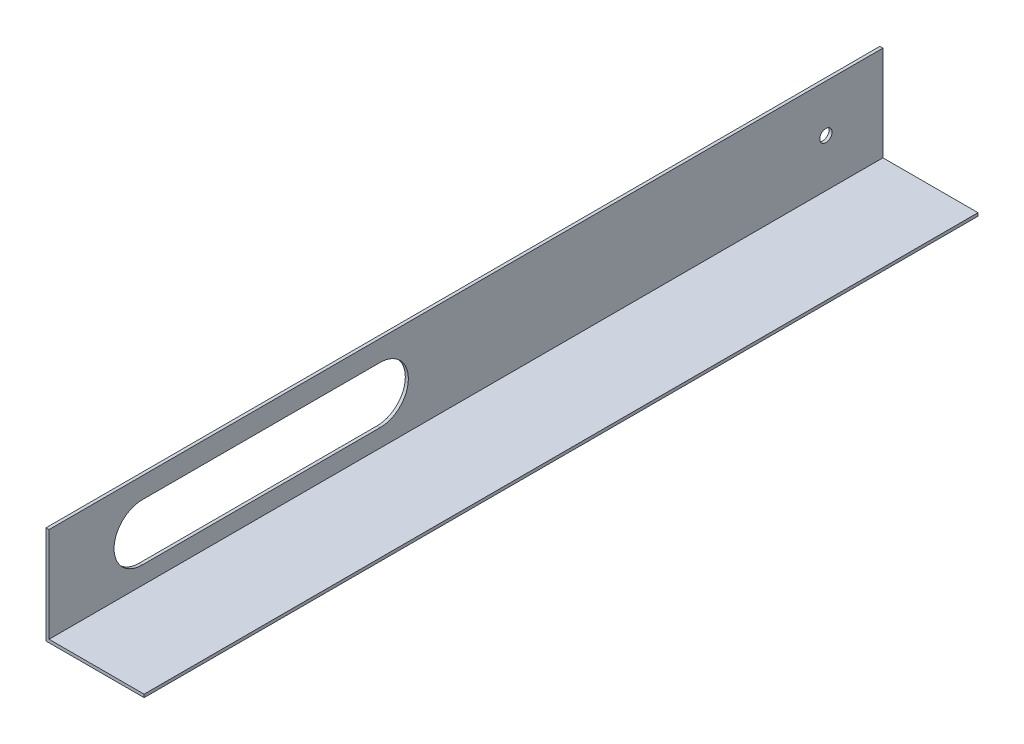
ISO-10303-21;
HEADER;
FILE_DESCRIPTION(('STEP AP214'),'2;1');
FILE_NAME('part.step','',(''),(''),'','','');
FILE_SCHEMA(('AUTOMOTIVE_DESIGN { 1 0 10303 214 1 1 1 1 }'));
ENDSEC;
DATA;
#1=APPLICATION_CONTEXT('core data for automotive mechanical design processes');
#2=APPLICATION_PROTOCOL_DEFINITION('international standard','automotive_design',2000,#1);
#3=PRODUCT_CONTEXT('',#1,'mechanical');
#4=PRODUCT('Part','Part','',(#3));
#5=PRODUCT_RELATED_PRODUCT_CATEGORY('part','',(#4));
#6=PRODUCT_DEFINITION_FORMATION('','',#4);
#7=PRODUCT_DEFINITION_CONTEXT('part definition',#1,'design');
#8=PRODUCT_DEFINITION('design','',#6,#7);
#9=PRODUCT_DEFINITION_SHAPE('','',#8);
#10=(LENGTH_UNIT() NAMED_UNIT(*) SI_UNIT(.MILLI.,.METRE.));
#11=(NAMED_UNIT(*) PLANE_ANGLE_UNIT() SI_UNIT($,.RADIAN.));
#12=(NAMED_UNIT(*) SI_UNIT($,.STERADIAN.) SOLID_ANGLE_UNIT());
#13=UNCERTAINTY_MEASURE_WITH_UNIT(LENGTH_MEASURE(1.E-05),#10,'distance_accuracy_value','');
#14=(GEOMETRIC_REPRESENTATION_CONTEXT(3) GLOBAL_UNCERTAINTY_ASSIGNED_CONTEXT((#13)) GLOBAL_UNIT_ASSIGNED_CONTEXT((#10,
#11,#12)) REPRESENTATION_CONTEXT('',''));
#15=CARTESIAN_POINT('',(0.,0.,0.));
#16=DIRECTION('',(0.,0.,1.));
#17=DIRECTION('',(1.,0.,0.));
#18=AXIS2_PLACEMENT_3D('',#15,#16,#17);
#19=CARTESIAN_POINT('',(49.2125,0.,431.8));
#20=DIRECTION('',(0.,-1.,0.));
#21=DIRECTION('',(1.,0.,0.));
#22=AXIS2_PLACEMENT_3D('',#19,#20,#21);
#23=PLANE('',#22);
#24=DIRECTION('',(-1.,0.,0.));
#25=VECTOR('',#24,1.);
#26=CARTESIAN_POINT('',(49.2125,0.,0.));
#27=LINE('',#26,#25);
#28=CARTESIAN_POINT('',(49.2125,0.,0.));
#29=VERTEX_POINT('',#28);
#30=CARTESIAN_POINT('',(0.,0.,0.));
#31=VERTEX_POINT('',#30);
#32=EDGE_CURVE('E136',#29,#31,#27,.T.);
#33=ORIENTED_EDGE('',*,*,#32,.T.);
#34=DIRECTION('',(0.,0.,-1.));
#35=VECTOR('',#34,1.);
#36=CARTESIAN_POINT('',(0.,0.,431.8));
#37=LINE('',#36,#35);
#38=CARTESIAN_POINT('',(0.,0.,431.8));
#39=VERTEX_POINT('',#38);
#40=EDGE_CURVE('E179',#39,#31,#37,.T.);
#41=ORIENTED_EDGE('',*,*,#40,.F.);
#42=DIRECTION('',(-1.,0.,0.));
#43=VECTOR('',#42,1.);
#44=CARTESIAN_POINT('',(49.2125,0.,431.8));
#45=LINE('',#44,#43);
#46=CARTESIAN_POINT('',(49.2125,0.,431.8));
#47=VERTEX_POINT('',#46);
#48=EDGE_CURVE('E139',#47,#39,#45,.T.);
#49=ORIENTED_EDGE('',*,*,#48,.F.);
#50=DIRECTION('',(0.,0.,-1.));
#51=VECTOR('',#50,1.);
#52=CARTESIAN_POINT('',(49.2125,0.,431.8));
#53=LINE('',#52,#51);
#54=EDGE_CURVE('E153',#47,#29,#53,.T.);
#55=ORIENTED_EDGE('',*,*,#54,.T.);
#56=EDGE_LOOP('',(#33,#41,#49,#55));
#57=FACE_BOUND('',#56,.T.);
#58=ADVANCED_FACE('F33',(#57),#23,.F.);
#59=CARTESIAN_POINT('',(0.,0.,431.8));
#60=DIRECTION('',(-1.,0.,0.));
#61=DIRECTION('',(0.,-1.,0.));
#62=AXIS2_PLACEMENT_3D('',#59,#60,#61);
#63=PLANE('',#62);
#64=CARTESIAN_POINT('',(0.,24.7735948291677,29.5387922851518));
#65=DIRECTION('',(1.,0.,0.));
#66=DIRECTION('',(0.,1.,0.));
#67=AXIS2_PLACEMENT_3D('',#64,#65,#66);
#68=CIRCLE('',#67,3.175);
#69=CARTESIAN_POINT('',(0.,27.9485948291677,29.5387922851518));
#70=VERTEX_POINT('',#69);
#71=EDGE_CURVE('E312',#70,#70,#68,.T.);
#72=ORIENTED_EDGE('',*,*,#71,.F.);
#73=EDGE_LOOP('',(#72));
#74=FACE_BOUND('',#73,.T.);
#75=DIRECTION('',(0.,0.,-1.));
#76=VECTOR('',#75,1.);
#77=CARTESIAN_POINT('',(0.,9.20749999999999,383.54));
#78=LINE('',#77,#76);
#79=CARTESIAN_POINT('',(0.,9.20749999999999,383.54));
#80=VERTEX_POINT('',#79);
#81=CARTESIAN_POINT('',(0.,9.20749999999999,260.35));
#82=VERTEX_POINT('',#81);
#83=EDGE_CURVE('E122',#80,#82,#78,.T.);
#84=ORIENTED_EDGE('',*,*,#83,.F.);
#85=CARTESIAN_POINT('',(0.,23.8125,383.54));
#86=DIRECTION('',(1.,0.,0.));
#87=DIRECTION('',(0.,1.,0.));
#88=AXIS2_PLACEMENT_3D('',#85,#86,#87);
#89=CIRCLE('',#88,14.605);
#90=CARTESIAN_POINT('',(0.,38.4175,383.54));
#91=VERTEX_POINT('',#90);
#92=EDGE_CURVE('E48',#91,#80,#89,.T.);
#93=ORIENTED_EDGE('',*,*,#92,.F.);
#94=DIRECTION('',(0.,0.,1.));
#95=VECTOR('',#94,1.);
#96=CARTESIAN_POINT('',(0.,38.4175,383.54));
#97=LINE('',#96,#95);
#98=CARTESIAN_POINT('',(0.,38.4175,260.35));
#99=VERTEX_POINT('',#98);
#100=EDGE_CURVE('E129',#99,#91,#97,.T.);
#101=ORIENTED_EDGE('',*,*,#100,.F.);
#102=CARTESIAN_POINT('',(0.,23.8125,260.35));
#103=DIRECTION('',(1.,0.,0.));
#104=DIRECTION('',(0.,1.,0.));
#105=AXIS2_PLACEMENT_3D('',#102,#103,#104);
#106=CIRCLE('',#105,14.605);
#107=EDGE_CURVE('E113',#82,#99,#106,.T.);
#108=ORIENTED_EDGE('',*,*,#107,.F.);
#109=EDGE_LOOP('',(#84,#93,#101,#108));
#110=FACE_BOUND('',#109,.T.);
#111=DIRECTION('',(0.,1.,0.));
#112=VECTOR('',#111,1.);
#113=CARTESIAN_POINT('',(0.,0.,0.));
#114=LINE('',#113,#112);
#115=CARTESIAN_POINT('',(0.,49.2125,0.));
#116=VERTEX_POINT('',#115);
#117=EDGE_CURVE('E156',#31,#116,#114,.T.);
#118=ORIENTED_EDGE('',*,*,#117,.T.);
#119=DIRECTION('',(0.,0.,-1.));
#120=VECTOR('',#119,1.);
#121=CARTESIAN_POINT('',(0.,49.2125,431.8));
#122=LINE('',#121,#120);
#123=CARTESIAN_POINT('',(0.,49.2125,431.8));
#124=VERTEX_POINT('',#123);
#125=EDGE_CURVE('E176',#124,#116,#122,.T.);
#126=ORIENTED_EDGE('',*,*,#125,.F.);
#127=DIRECTION('',(0.,1.,0.));
#128=VECTOR('',#127,1.);
#129=CARTESIAN_POINT('',(0.,0.,431.8));
#130=LINE('',#129,#128);
#131=EDGE_CURVE('E142',#39,#124,#130,.T.);
#132=ORIENTED_EDGE('',*,*,#131,.F.);
#133=ORIENTED_EDGE('',*,*,#40,.T.);
#134=EDGE_LOOP('',(#118,#126,#132,#133));
#135=FACE_BOUND('',#134,.T.);
#136=ADVANCED_FACE('F126',(#74,#110,#135),#63,.F.);
#137=CARTESIAN_POINT('',(0.,49.2125,431.8));
#138=DIRECTION('',(0.,-1.,0.));
#139=DIRECTION('',(1.,0.,0.));
#140=AXIS2_PLACEMENT_3D('',#137,#138,#139);
#141=PLANE('',#140);
#142=DIRECTION('',(-1.,0.,0.));
#143=VECTOR('',#142,1.);
#144=CARTESIAN_POINT('',(0.,49.2125,0.));
#145=LINE('',#144,#143);
#146=CARTESIAN_POINT('',(-1.5875,49.2125,0.));
#147=VERTEX_POINT('',#146);
#148=EDGE_CURVE('E158',#116,#147,#145,.T.);
#149=ORIENTED_EDGE('',*,*,#148,.T.);
#150=DIRECTION('',(0.,0.,-1.));
#151=VECTOR('',#150,1.);
#152=CARTESIAN_POINT('',(-1.5875,49.2125,431.8));
#153=LINE('',#152,#151);
#154=CARTESIAN_POINT('',(-1.5875,49.2125,431.8));
#155=VERTEX_POINT('',#154);
#156=EDGE_CURVE('E173',#155,#147,#153,.T.);
#157=ORIENTED_EDGE('',*,*,#156,.F.);
#158=DIRECTION('',(-1.,0.,0.));
#159=VECTOR('',#158,1.);
#160=CARTESIAN_POINT('',(0.,49.2125,431.8));
#161=LINE('',#160,#159);
#162=EDGE_CURVE('E145',#124,#155,#161,.T.);
#163=ORIENTED_EDGE('',*,*,#162,.F.);
#164=ORIENTED_EDGE('',*,*,#125,.T.);
#165=EDGE_LOOP('',(#149,#157,#163,#164));
#166=FACE_BOUND('',#165,.T.);
#167=ADVANCED_FACE('F211',(#166),#141,.F.);
#168=CARTESIAN_POINT('',(-1.5875,49.2125,431.8));
#169=DIRECTION('',(1.,0.,0.));
#170=DIRECTION('',(0.,1.,0.));
#171=AXIS2_PLACEMENT_3D('',#168,#169,#170);
#172=PLANE('',#171);
#173=CARTESIAN_POINT('',(-1.58749999999999,24.7735948291677,29.5387922851518));
#174=DIRECTION('',(1.,0.,0.));
#175=DIRECTION('',(0.,1.,0.));
#176=AXIS2_PLACEMENT_3D('',#173,#174,#175);
#177=CIRCLE('',#176,3.175);
#178=CARTESIAN_POINT('',(-1.58749999999999,27.9485948291677,29.5387922851518));
#179=VERTEX_POINT('',#178);
#180=EDGE_CURVE('E36',#179,#179,#177,.T.);
#181=ORIENTED_EDGE('',*,*,#180,.T.);
#182=EDGE_LOOP('',(#181));
#183=FACE_BOUND('',#182,.T.);
#184=DIRECTION('',(0.,0.,1.));
#185=VECTOR('',#184,1.);
#186=CARTESIAN_POINT('',(-1.5875,38.4175,431.8));
#187=LINE('',#186,#185);
#188=CARTESIAN_POINT('',(-1.58749999999999,38.4175,260.35));
#189=VERTEX_POINT('',#188);
#190=CARTESIAN_POINT('',(-1.58749999999999,38.4175,383.54));
#191=VERTEX_POINT('',#190);
#192=EDGE_CURVE('E41',#189,#191,#187,.T.);
#193=ORIENTED_EDGE('',*,*,#192,.T.);
#194=CARTESIAN_POINT('',(-1.58749999999999,23.8125,383.54));
#195=DIRECTION('',(1.,0.,0.));
#196=DIRECTION('',(0.,1.,0.));
#197=AXIS2_PLACEMENT_3D('',#194,#195,#196);
#198=CIRCLE('',#197,14.605);
#199=CARTESIAN_POINT('',(-1.58749999999999,9.20749999999999,383.54));
#200=VERTEX_POINT('',#199);
#201=EDGE_CURVE('E11',#191,#200,#198,.T.);
#202=ORIENTED_EDGE('',*,*,#201,.T.);
#203=DIRECTION('',(0.,0.,-1.));
#204=VECTOR('',#203,1.);
#205=CARTESIAN_POINT('',(-1.5875,9.20749999999999,431.8));
#206=LINE('',#205,#204);
#207=CARTESIAN_POINT('',(-1.5875,9.20749999999999,260.35));
#208=VERTEX_POINT('',#207);
#209=EDGE_CURVE('E182',#200,#208,#206,.T.);
#210=ORIENTED_EDGE('',*,*,#209,.T.);
#211=CARTESIAN_POINT('',(-1.58749999999999,23.8125,260.35));
#212=DIRECTION('',(1.,0.,0.));
#213=DIRECTION('',(0.,1.,0.));
#214=AXIS2_PLACEMENT_3D('',#211,#212,#213);
#215=CIRCLE('',#214,14.605);
#216=EDGE_CURVE('E116',#208,#189,#215,.T.);
#217=ORIENTED_EDGE('',*,*,#216,.T.);
#218=EDGE_LOOP('',(#193,#202,#210,#217));
#219=FACE_BOUND('',#218,.T.);
#220=DIRECTION('',(0.,-1.,0.));
#221=VECTOR('',#220,1.);
#222=CARTESIAN_POINT('',(-1.5875,49.2125,0.));
#223=LINE('',#222,#221);
#224=CARTESIAN_POINT('',(-1.58750000000001,-1.5875,0.));
#225=VERTEX_POINT('',#224);
#226=EDGE_CURVE('E160',#147,#225,#223,.T.);
#227=ORIENTED_EDGE('',*,*,#226,.T.);
#228=DIRECTION('',(0.,0.,-1.));
#229=VECTOR('',#228,1.);
#230=CARTESIAN_POINT('',(-1.58750000000001,-1.5875,431.8));
#231=LINE('',#230,#229);
#232=CARTESIAN_POINT('',(-1.58750000000001,-1.5875,431.8));
#233=VERTEX_POINT('',#232);
#234=EDGE_CURVE('E170',#233,#225,#231,.T.);
#235=ORIENTED_EDGE('',*,*,#234,.F.);
#236=DIRECTION('',(0.,-1.,0.));
#237=VECTOR('',#236,1.);
#238=CARTESIAN_POINT('',(-1.5875,49.2125,431.8));
#239=LINE('',#238,#237);
#240=EDGE_CURVE('E147',#155,#233,#239,.T.);
#241=ORIENTED_EDGE('',*,*,#240,.F.);
#242=ORIENTED_EDGE('',*,*,#156,.T.);
#243=EDGE_LOOP('',(#227,#235,#241,#242));
#244=FACE_BOUND('',#243,.T.);
#245=ADVANCED_FACE('F187',(#183,#219,#244),#172,.F.);
#246=CARTESIAN_POINT('',(-1.58750000000001,-1.5875,431.8));
#247=DIRECTION('',(0.,1.,0.));
#248=DIRECTION('',(-1.,0.,0.));
#249=AXIS2_PLACEMENT_3D('',#246,#247,#248);
#250=PLANE('',#249);
#251=DIRECTION('',(1.,0.,0.));
#252=VECTOR('',#251,1.);
#253=CARTESIAN_POINT('',(-1.58750000000001,-1.5875,0.));
#254=LINE('',#253,#252);
#255=CARTESIAN_POINT('',(49.2125,-1.58749999999999,0.));
#256=VERTEX_POINT('',#255);
#257=EDGE_CURVE('E162',#225,#256,#254,.T.);
#258=ORIENTED_EDGE('',*,*,#257,.T.);
#259=DIRECTION('',(0.,0.,-1.));
#260=VECTOR('',#259,1.);
#261=CARTESIAN_POINT('',(49.2125,-1.58749999999999,431.8));
#262=LINE('',#261,#260);
#263=CARTESIAN_POINT('',(49.2125,-1.58749999999999,431.8));
#264=VERTEX_POINT('',#263);
#265=EDGE_CURVE('E167',#264,#256,#262,.T.);
#266=ORIENTED_EDGE('',*,*,#265,.F.);
#267=DIRECTION('',(1.,0.,0.));
#268=VECTOR('',#267,1.);
#269=CARTESIAN_POINT('',(-1.58750000000001,-1.5875,431.8));
#270=LINE('',#269,#268);
#271=EDGE_CURVE('E149',#233,#264,#270,.T.);
#272=ORIENTED_EDGE('',*,*,#271,.F.);
#273=ORIENTED_EDGE('',*,*,#234,.T.);
#274=EDGE_LOOP('',(#258,#266,#272,#273));
#275=FACE_BOUND('',#274,.T.);
#276=ADVANCED_FACE('F230',(#275),#250,.F.);
#277=CARTESIAN_POINT('',(49.2125,-1.58749999999999,431.8));
#278=DIRECTION('',(-1.,0.,0.));
#279=DIRECTION('',(0.,-1.,0.));
#280=AXIS2_PLACEMENT_3D('',#277,#278,#279);
#281=PLANE('',#280);
#282=DIRECTION('',(0.,1.,0.));
#283=VECTOR('',#282,1.);
#284=CARTESIAN_POINT('',(49.2125,-1.58749999999999,0.));
#285=LINE('',#284,#283);
#286=EDGE_CURVE('E143',#256,#29,#285,.T.);
#287=ORIENTED_EDGE('',*,*,#286,.T.);
#288=ORIENTED_EDGE('',*,*,#54,.F.);
#289=DIRECTION('',(0.,1.,0.));
#290=VECTOR('',#289,1.);
#291=CARTESIAN_POINT('',(49.2125,-1.58749999999999,431.8));
#292=LINE('',#291,#290);
#293=EDGE_CURVE('E151',#264,#47,#292,.T.);
#294=ORIENTED_EDGE('',*,*,#293,.F.);
#295=ORIENTED_EDGE('',*,*,#265,.T.);
#296=EDGE_LOOP('',(#287,#288,#294,#295));
#297=FACE_BOUND('',#296,.T.);
#298=ADVANCED_FACE('F228',(#297),#281,.F.);
#299=CARTESIAN_POINT('',(0.,0.,431.8));
#300=DIRECTION('',(0.,0.,-1.));
#301=DIRECTION('',(-1.,0.,0.));
#302=AXIS2_PLACEMENT_3D('',#299,#300,#301);
#303=PLANE('',#302);
#304=ORIENTED_EDGE('',*,*,#48,.T.);
#305=ORIENTED_EDGE('',*,*,#131,.T.);
#306=ORIENTED_EDGE('',*,*,#162,.T.);
#307=ORIENTED_EDGE('',*,*,#240,.T.);
#308=ORIENTED_EDGE('',*,*,#271,.T.);
#309=ORIENTED_EDGE('',*,*,#293,.T.);
#310=EDGE_LOOP('',(#304,#305,#306,#307,#308,#309));
#311=FACE_BOUND('',#310,.T.);
#312=ADVANCED_FACE('F201',(#311),#303,.F.);
#313=CARTESIAN_POINT('',(0.,0.,0.));
#314=DIRECTION('',(0.,0.,-1.));
#315=DIRECTION('',(-1.,0.,0.));
#316=AXIS2_PLACEMENT_3D('',#313,#314,#315);
#317=PLANE('',#316);
#318=ORIENTED_EDGE('',*,*,#32,.F.);
#319=ORIENTED_EDGE('',*,*,#286,.F.);
#320=ORIENTED_EDGE('',*,*,#257,.F.);
#321=ORIENTED_EDGE('',*,*,#226,.F.);
#322=ORIENTED_EDGE('',*,*,#148,.F.);
#323=ORIENTED_EDGE('',*,*,#117,.F.);
#324=EDGE_LOOP('',(#318,#319,#320,#321,#322,#323));
#325=FACE_BOUND('',#324,.T.);
#326=ADVANCED_FACE('F194',(#325),#317,.T.);
#327=CARTESIAN_POINT('',(-127.,23.8125,383.54));
#328=DIRECTION('',(1.,0.,0.));
#329=DIRECTION('',(0.,1.,0.));
#330=AXIS2_PLACEMENT_3D('',#327,#328,#329);
#331=CYLINDRICAL_SURFACE('',#330,14.605);
#332=DIRECTION('',(1.,0.,0.));
#333=VECTOR('',#332,1.);
#334=CARTESIAN_POINT('',(-127.,38.4175,383.54));
#335=LINE('',#334,#333);
#336=EDGE_CURVE('E134',#191,#91,#335,.T.);
#337=ORIENTED_EDGE('',*,*,#336,.T.);
#338=ORIENTED_EDGE('',*,*,#92,.T.);
#339=DIRECTION('',(1.,0.,0.));
#340=VECTOR('',#339,1.);
#341=CARTESIAN_POINT('',(-127.,9.2075,383.54));
#342=LINE('',#341,#340);
#343=EDGE_CURVE('E119',#200,#80,#342,.T.);
#344=ORIENTED_EDGE('',*,*,#343,.F.);
#345=ORIENTED_EDGE('',*,*,#201,.F.);
#346=EDGE_LOOP('',(#337,#338,#344,#345));
#347=FACE_BOUND('',#346,.T.);
#348=ADVANCED_FACE('F192',(#347),#331,.F.);
#349=CARTESIAN_POINT('',(-127.,38.4175,383.54));
#350=DIRECTION('',(0.,1.,0.));
#351=DIRECTION('',(-1.,0.,0.));
#352=AXIS2_PLACEMENT_3D('',#349,#350,#351);
#353=PLANE('',#352);
#354=DIRECTION('',(1.,0.,0.));
#355=VECTOR('',#354,1.);
#356=CARTESIAN_POINT('',(-127.,38.4175,260.35));
#357=LINE('',#356,#355);
#358=EDGE_CURVE('E118',#189,#99,#357,.T.);
#359=ORIENTED_EDGE('',*,*,#358,.T.);
#360=ORIENTED_EDGE('',*,*,#100,.T.);
#361=ORIENTED_EDGE('',*,*,#336,.F.);
#362=ORIENTED_EDGE('',*,*,#192,.F.);
#363=EDGE_LOOP('',(#359,#360,#361,#362));
#364=FACE_BOUND('',#363,.T.);
#365=ADVANCED_FACE('F191',(#364),#353,.F.);
#366=CARTESIAN_POINT('',(-127.,23.8125,260.35));
#367=DIRECTION('',(1.,0.,0.));
#368=DIRECTION('',(0.,1.,0.));
#369=AXIS2_PLACEMENT_3D('',#366,#367,#368);
#370=CYLINDRICAL_SURFACE('',#369,14.605);
#371=DIRECTION('',(1.,0.,0.));
#372=VECTOR('',#371,1.);
#373=CARTESIAN_POINT('',(-127.,9.2075,260.35));
#374=LINE('',#373,#372);
#375=EDGE_CURVE('E56',#208,#82,#374,.T.);
#376=ORIENTED_EDGE('',*,*,#375,.T.);
#377=ORIENTED_EDGE('',*,*,#107,.T.);
#378=ORIENTED_EDGE('',*,*,#358,.F.);
#379=ORIENTED_EDGE('',*,*,#216,.F.);
#380=EDGE_LOOP('',(#376,#377,#378,#379));
#381=FACE_BOUND('',#380,.T.);
#382=ADVANCED_FACE('F110',(#381),#370,.F.);
#383=CARTESIAN_POINT('',(-127.,9.2075,383.54));
#384=DIRECTION('',(0.,-1.,0.));
#385=DIRECTION('',(1.,0.,0.));
#386=AXIS2_PLACEMENT_3D('',#383,#384,#385);
#387=PLANE('',#386);
#388=ORIENTED_EDGE('',*,*,#343,.T.);
#389=ORIENTED_EDGE('',*,*,#83,.T.);
#390=ORIENTED_EDGE('',*,*,#375,.F.);
#391=ORIENTED_EDGE('',*,*,#209,.F.);
#392=EDGE_LOOP('',(#388,#389,#390,#391));
#393=FACE_BOUND('',#392,.T.);
#394=ADVANCED_FACE('F123',(#393),#387,.F.);
#395=CARTESIAN_POINT('',(-127.,24.7735948291677,29.5387922851518));
#396=DIRECTION('',(1.,0.,0.));
#397=DIRECTION('',(0.,1.,0.));
#398=AXIS2_PLACEMENT_3D('',#395,#396,#397);
#399=CYLINDRICAL_SURFACE('',#398,3.175);
#400=ORIENTED_EDGE('',*,*,#71,.T.);
#401=EDGE_LOOP('',(#400));
#402=FACE_BOUND('',#401,.T.);
#403=ORIENTED_EDGE('',*,*,#180,.F.);
#404=EDGE_LOOP('',(#403));
#405=FACE_BOUND('',#404,.T.);
#406=ADVANCED_FACE('F282',(#402,#405),#399,.F.);
#407=CLOSED_SHELL('',(#58,#136,#167,#245,#276,#298,#312,#326,#348,#365,#382,#394,#406));
#408=MANIFOLD_SOLID_BREP('B2',#407);
#409=ADVANCED_BREP_SHAPE_REPRESENTATION('',(#18,#408),#14);
#410=SHAPE_DEFINITION_REPRESENTATION(#9,#409);
ENDSEC;
END-ISO-10303-21;
